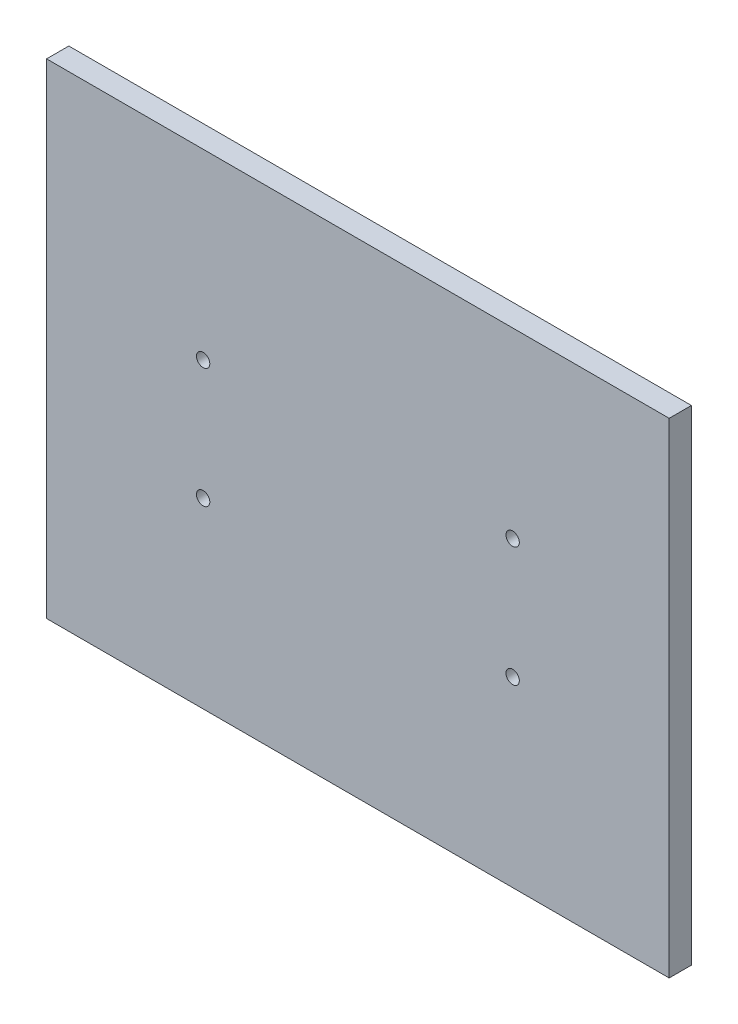
ISO-10303-21;
HEADER;
FILE_DESCRIPTION(('STEP AP214'),'2;1');
FILE_NAME('part.step','',(''),(''),'','','');
FILE_SCHEMA(('AUTOMOTIVE_DESIGN { 1 0 10303 214 1 1 1 1 }'));
ENDSEC;
DATA;
#1=APPLICATION_CONTEXT('core data for automotive mechanical design processes');
#2=APPLICATION_PROTOCOL_DEFINITION('international standard','automotive_design',2000,#1);
#3=PRODUCT_CONTEXT('',#1,'mechanical');
#4=PRODUCT('Part','Part','',(#3));
#5=PRODUCT_RELATED_PRODUCT_CATEGORY('part','',(#4));
#6=PRODUCT_DEFINITION_FORMATION('','',#4);
#7=PRODUCT_DEFINITION_CONTEXT('part definition',#1,'design');
#8=PRODUCT_DEFINITION('design','',#6,#7);
#9=PRODUCT_DEFINITION_SHAPE('','',#8);
#10=(LENGTH_UNIT() NAMED_UNIT(*) SI_UNIT(.MILLI.,.METRE.));
#11=(NAMED_UNIT(*) PLANE_ANGLE_UNIT() SI_UNIT($,.RADIAN.));
#12=(NAMED_UNIT(*) SI_UNIT($,.STERADIAN.) SOLID_ANGLE_UNIT());
#13=UNCERTAINTY_MEASURE_WITH_UNIT(LENGTH_MEASURE(1.E-05),#10,'distance_accuracy_value','');
#14=(GEOMETRIC_REPRESENTATION_CONTEXT(3) GLOBAL_UNCERTAINTY_ASSIGNED_CONTEXT((#13)) GLOBAL_UNIT_ASSIGNED_CONTEXT((#10,
#11,#12)) REPRESENTATION_CONTEXT('',''));
#15=CARTESIAN_POINT('',(0.,0.,0.));
#16=DIRECTION('',(0.,0.,1.));
#17=DIRECTION('',(1.,0.,0.));
#18=AXIS2_PLACEMENT_3D('',#15,#16,#17);
#19=CARTESIAN_POINT('',(70.,-54.5,5.));
#20=DIRECTION('',(-1.,0.,0.));
#21=DIRECTION('',(0.,0.,1.));
#22=AXIS2_PLACEMENT_3D('',#19,#20,#21);
#23=PLANE('',#22);
#24=DIRECTION('',(0.,1.,0.));
#25=VECTOR('',#24,1.);
#26=CARTESIAN_POINT('',(70.,-54.5,0.));
#27=LINE('',#26,#25);
#28=CARTESIAN_POINT('',(70.,-54.5,0.));
#29=VERTEX_POINT('',#28);
#30=CARTESIAN_POINT('',(70.,54.5,0.));
#31=VERTEX_POINT('',#30);
#32=EDGE_CURVE('E107',#29,#31,#27,.T.);
#33=ORIENTED_EDGE('',*,*,#32,.T.);
#34=DIRECTION('',(0.,0.,-1.));
#35=VECTOR('',#34,1.);
#36=CARTESIAN_POINT('',(70.,54.5,5.));
#37=LINE('',#36,#35);
#38=CARTESIAN_POINT('',(70.,54.5,5.));
#39=VERTEX_POINT('',#38);
#40=EDGE_CURVE('E11',#39,#31,#37,.T.);
#41=ORIENTED_EDGE('',*,*,#40,.F.);
#42=DIRECTION('',(0.,1.,0.));
#43=VECTOR('',#42,1.);
#44=CARTESIAN_POINT('',(70.,-54.5,5.));
#45=LINE('',#44,#43);
#46=CARTESIAN_POINT('',(70.,-54.5,5.));
#47=VERTEX_POINT('',#46);
#48=EDGE_CURVE('E91',#47,#39,#45,.T.);
#49=ORIENTED_EDGE('',*,*,#48,.F.);
#50=DIRECTION('',(0.,0.,-1.));
#51=VECTOR('',#50,1.);
#52=CARTESIAN_POINT('',(70.,-54.5,5.));
#53=LINE('',#52,#51);
#54=EDGE_CURVE('E103',#47,#29,#53,.T.);
#55=ORIENTED_EDGE('',*,*,#54,.T.);
#56=EDGE_LOOP('',(#33,#41,#49,#55));
#57=FACE_BOUND('',#56,.T.);
#58=ADVANCED_FACE('F39',(#57),#23,.F.);
#59=CARTESIAN_POINT('',(-70.,54.5,5.));
#60=DIRECTION('',(0.,-1.,0.));
#61=DIRECTION('',(0.,0.,-1.));
#62=AXIS2_PLACEMENT_3D('',#59,#60,#61);
#63=PLANE('',#62);
#64=DIRECTION('',(-1.,0.,0.));
#65=VECTOR('',#64,1.);
#66=CARTESIAN_POINT('',(-70.,54.5,0.));
#67=LINE('',#66,#65);
#68=CARTESIAN_POINT('',(-70.,54.5,0.));
#69=VERTEX_POINT('',#68);
#70=EDGE_CURVE('E96',#31,#69,#67,.T.);
#71=ORIENTED_EDGE('',*,*,#70,.T.);
#72=DIRECTION('',(0.,0.,-1.));
#73=VECTOR('',#72,1.);
#74=CARTESIAN_POINT('',(-70.,54.5,5.));
#75=LINE('',#74,#73);
#76=CARTESIAN_POINT('',(-70.,54.5,5.));
#77=VERTEX_POINT('',#76);
#78=EDGE_CURVE('E48',#77,#69,#75,.T.);
#79=ORIENTED_EDGE('',*,*,#78,.F.);
#80=DIRECTION('',(-1.,0.,0.));
#81=VECTOR('',#80,1.);
#82=CARTESIAN_POINT('',(-70.,54.5,5.));
#83=LINE('',#82,#81);
#84=EDGE_CURVE('E86',#39,#77,#83,.T.);
#85=ORIENTED_EDGE('',*,*,#84,.F.);
#86=ORIENTED_EDGE('',*,*,#40,.T.);
#87=EDGE_LOOP('',(#71,#79,#85,#86));
#88=FACE_BOUND('',#87,.T.);
#89=ADVANCED_FACE('F95',(#88),#63,.F.);
#90=CARTESIAN_POINT('',(-70.,-54.5,5.));
#91=DIRECTION('',(1.,0.,0.));
#92=DIRECTION('',(0.,0.,-1.));
#93=AXIS2_PLACEMENT_3D('',#90,#91,#92);
#94=PLANE('',#93);
#95=DIRECTION('',(0.,-1.,0.));
#96=VECTOR('',#95,1.);
#97=CARTESIAN_POINT('',(-70.,-54.5,0.));
#98=LINE('',#97,#96);
#99=CARTESIAN_POINT('',(-70.,-54.5,0.));
#100=VERTEX_POINT('',#99);
#101=EDGE_CURVE('E73',#69,#100,#98,.T.);
#102=ORIENTED_EDGE('',*,*,#101,.T.);
#103=DIRECTION('',(0.,0.,-1.));
#104=VECTOR('',#103,1.);
#105=CARTESIAN_POINT('',(-70.,-54.5,5.));
#106=LINE('',#105,#104);
#107=CARTESIAN_POINT('',(-70.,-54.5,5.));
#108=VERTEX_POINT('',#107);
#109=EDGE_CURVE('E98',#108,#100,#106,.T.);
#110=ORIENTED_EDGE('',*,*,#109,.F.);
#111=DIRECTION('',(0.,-1.,0.));
#112=VECTOR('',#111,1.);
#113=CARTESIAN_POINT('',(-70.,-54.5,5.));
#114=LINE('',#113,#112);
#115=EDGE_CURVE('E89',#77,#108,#114,.T.);
#116=ORIENTED_EDGE('',*,*,#115,.F.);
#117=ORIENTED_EDGE('',*,*,#78,.T.);
#118=EDGE_LOOP('',(#102,#110,#116,#117));
#119=FACE_BOUND('',#118,.T.);
#120=ADVANCED_FACE('F99',(#119),#94,.F.);
#121=CARTESIAN_POINT('',(-70.,-54.5,5.));
#122=DIRECTION('',(0.,1.,0.));
#123=DIRECTION('',(0.,0.,1.));
#124=AXIS2_PLACEMENT_3D('',#121,#122,#123);
#125=PLANE('',#124);
#126=DIRECTION('',(1.,0.,0.));
#127=VECTOR('',#126,1.);
#128=CARTESIAN_POINT('',(-70.,-54.5,0.));
#129=LINE('',#128,#127);
#130=EDGE_CURVE('E79',#100,#29,#129,.T.);
#131=ORIENTED_EDGE('',*,*,#130,.T.);
#132=ORIENTED_EDGE('',*,*,#54,.F.);
#133=DIRECTION('',(1.,0.,0.));
#134=VECTOR('',#133,1.);
#135=CARTESIAN_POINT('',(-70.,-54.5,5.));
#136=LINE('',#135,#134);
#137=EDGE_CURVE('E56',#108,#47,#136,.T.);
#138=ORIENTED_EDGE('',*,*,#137,.F.);
#139=ORIENTED_EDGE('',*,*,#109,.T.);
#140=EDGE_LOOP('',(#131,#132,#138,#139));
#141=FACE_BOUND('',#140,.T.);
#142=ADVANCED_FACE('F121',(#141),#125,.F.);
#143=CARTESIAN_POINT('',(0.,0.,5.));
#144=DIRECTION('',(0.,0.,-1.));
#145=DIRECTION('',(-1.,0.,0.));
#146=AXIS2_PLACEMENT_3D('',#143,#144,#145);
#147=PLANE('',#146);
#148=CARTESIAN_POINT('',(-34.7999999999997,-13.46,5.));
#149=DIRECTION('',(0.,0.,1.));
#150=DIRECTION('',(1.,0.,0.));
#151=AXIS2_PLACEMENT_3D('',#148,#149,#150);
#152=CIRCLE('',#151,1.5);
#153=CARTESIAN_POINT('',(-33.2999999999997,-13.46,5.));
#154=VERTEX_POINT('',#153);
#155=EDGE_CURVE('E136',#154,#154,#152,.T.);
#156=ORIENTED_EDGE('',*,*,#155,.F.);
#157=EDGE_LOOP('',(#156));
#158=FACE_BOUND('',#157,.T.);
#159=CARTESIAN_POINT('',(34.8000000000003,-13.46,5.));
#160=DIRECTION('',(0.,0.,1.));
#161=DIRECTION('',(1.,0.,0.));
#162=AXIS2_PLACEMENT_3D('',#159,#160,#161);
#163=CIRCLE('',#162,1.5);
#164=CARTESIAN_POINT('',(36.3000000000003,-13.46,5.));
#165=VERTEX_POINT('',#164);
#166=EDGE_CURVE('E144',#165,#165,#163,.T.);
#167=ORIENTED_EDGE('',*,*,#166,.F.);
#168=EDGE_LOOP('',(#167));
#169=FACE_BOUND('',#168,.T.);
#170=CARTESIAN_POINT('',(34.8,13.46,5.));
#171=DIRECTION('',(0.,0.,1.));
#172=DIRECTION('',(1.,0.,0.));
#173=AXIS2_PLACEMENT_3D('',#170,#171,#172);
#174=CIRCLE('',#173,1.5);
#175=CARTESIAN_POINT('',(36.3,13.46,5.));
#176=VERTEX_POINT('',#175);
#177=EDGE_CURVE('E152',#176,#176,#174,.T.);
#178=ORIENTED_EDGE('',*,*,#177,.F.);
#179=EDGE_LOOP('',(#178));
#180=FACE_BOUND('',#179,.T.);
#181=CARTESIAN_POINT('',(-34.8,13.46,5.));
#182=DIRECTION('',(0.,0.,1.));
#183=DIRECTION('',(1.,0.,0.));
#184=AXIS2_PLACEMENT_3D('',#181,#182,#183);
#185=CIRCLE('',#184,1.5);
#186=CARTESIAN_POINT('',(-33.3,13.46,5.));
#187=VERTEX_POINT('',#186);
#188=EDGE_CURVE('E128',#187,#187,#185,.T.);
#189=ORIENTED_EDGE('',*,*,#188,.F.);
#190=EDGE_LOOP('',(#189));
#191=FACE_BOUND('',#190,.T.);
#192=ORIENTED_EDGE('',*,*,#48,.T.);
#193=ORIENTED_EDGE('',*,*,#84,.T.);
#194=ORIENTED_EDGE('',*,*,#115,.T.);
#195=ORIENTED_EDGE('',*,*,#137,.T.);
#196=EDGE_LOOP('',(#192,#193,#194,#195));
#197=FACE_BOUND('',#196,.T.);
#198=ADVANCED_FACE('F87',(#158,#169,#180,#191,#197),#147,.F.);
#199=CARTESIAN_POINT('',(0.,0.,0.));
#200=DIRECTION('',(0.,0.,-1.));
#201=DIRECTION('',(-1.,0.,0.));
#202=AXIS2_PLACEMENT_3D('',#199,#200,#201);
#203=PLANE('',#202);
#204=CARTESIAN_POINT('',(-34.7999999999997,-13.46,0.));
#205=DIRECTION('',(0.,0.,1.));
#206=DIRECTION('',(1.,0.,0.));
#207=AXIS2_PLACEMENT_3D('',#204,#205,#206);
#208=CIRCLE('',#207,1.5);
#209=CARTESIAN_POINT('',(-33.2999999999997,-13.46,0.));
#210=VERTEX_POINT('',#209);
#211=EDGE_CURVE('E140',#210,#210,#208,.T.);
#212=ORIENTED_EDGE('',*,*,#211,.T.);
#213=EDGE_LOOP('',(#212));
#214=FACE_BOUND('',#213,.T.);
#215=CARTESIAN_POINT('',(34.8000000000003,-13.46,0.));
#216=DIRECTION('',(0.,0.,1.));
#217=DIRECTION('',(1.,0.,0.));
#218=AXIS2_PLACEMENT_3D('',#215,#216,#217);
#219=CIRCLE('',#218,1.5);
#220=CARTESIAN_POINT('',(36.3000000000003,-13.46,0.));
#221=VERTEX_POINT('',#220);
#222=EDGE_CURVE('E148',#221,#221,#219,.T.);
#223=ORIENTED_EDGE('',*,*,#222,.T.);
#224=EDGE_LOOP('',(#223));
#225=FACE_BOUND('',#224,.T.);
#226=CARTESIAN_POINT('',(34.8,13.46,0.));
#227=DIRECTION('',(0.,0.,1.));
#228=DIRECTION('',(1.,0.,0.));
#229=AXIS2_PLACEMENT_3D('',#226,#227,#228);
#230=CIRCLE('',#229,1.5);
#231=CARTESIAN_POINT('',(36.3,13.46,0.));
#232=VERTEX_POINT('',#231);
#233=EDGE_CURVE('E132',#232,#232,#230,.T.);
#234=ORIENTED_EDGE('',*,*,#233,.T.);
#235=EDGE_LOOP('',(#234));
#236=FACE_BOUND('',#235,.T.);
#237=CARTESIAN_POINT('',(-34.8,13.46,0.));
#238=DIRECTION('',(0.,0.,1.));
#239=DIRECTION('',(1.,0.,0.));
#240=AXIS2_PLACEMENT_3D('',#237,#238,#239);
#241=CIRCLE('',#240,1.5);
#242=CARTESIAN_POINT('',(-33.3,13.46,0.));
#243=VERTEX_POINT('',#242);
#244=EDGE_CURVE('E111',#243,#243,#241,.T.);
#245=ORIENTED_EDGE('',*,*,#244,.T.);
#246=EDGE_LOOP('',(#245));
#247=FACE_BOUND('',#246,.T.);
#248=ORIENTED_EDGE('',*,*,#32,.F.);
#249=ORIENTED_EDGE('',*,*,#130,.F.);
#250=ORIENTED_EDGE('',*,*,#101,.F.);
#251=ORIENTED_EDGE('',*,*,#70,.F.);
#252=EDGE_LOOP('',(#248,#249,#250,#251));
#253=FACE_BOUND('',#252,.T.);
#254=ADVANCED_FACE('F124',(#214,#225,#236,#247,#253),#203,.T.);
#255=CARTESIAN_POINT('',(-34.8,13.46,0.));
#256=DIRECTION('',(0.,0.,1.));
#257=DIRECTION('',(1.,0.,0.));
#258=AXIS2_PLACEMENT_3D('',#255,#256,#257);
#259=CYLINDRICAL_SURFACE('',#258,1.5);
#260=ORIENTED_EDGE('',*,*,#244,.F.);
#261=EDGE_LOOP('',(#260));
#262=FACE_BOUND('',#261,.T.);
#263=ORIENTED_EDGE('',*,*,#188,.T.);
#264=EDGE_LOOP('',(#263));
#265=FACE_BOUND('',#264,.T.);
#266=ADVANCED_FACE('F166',(#262,#265),#259,.F.);
#267=CARTESIAN_POINT('',(34.8,13.46,0.));
#268=DIRECTION('',(0.,0.,1.));
#269=DIRECTION('',(1.,0.,0.));
#270=AXIS2_PLACEMENT_3D('',#267,#268,#269);
#271=CYLINDRICAL_SURFACE('',#270,1.5);
#272=ORIENTED_EDGE('',*,*,#233,.F.);
#273=EDGE_LOOP('',(#272));
#274=FACE_BOUND('',#273,.T.);
#275=ORIENTED_EDGE('',*,*,#177,.T.);
#276=EDGE_LOOP('',(#275));
#277=FACE_BOUND('',#276,.T.);
#278=ADVANCED_FACE('F162',(#274,#277),#271,.F.);
#279=CARTESIAN_POINT('',(34.8000000000003,-13.46,0.));
#280=DIRECTION('',(0.,0.,1.));
#281=DIRECTION('',(1.,0.,0.));
#282=AXIS2_PLACEMENT_3D('',#279,#280,#281);
#283=CYLINDRICAL_SURFACE('',#282,1.5);
#284=ORIENTED_EDGE('',*,*,#222,.F.);
#285=EDGE_LOOP('',(#284));
#286=FACE_BOUND('',#285,.T.);
#287=ORIENTED_EDGE('',*,*,#166,.T.);
#288=EDGE_LOOP('',(#287));
#289=FACE_BOUND('',#288,.T.);
#290=ADVANCED_FACE('F165',(#286,#289),#283,.F.);
#291=CARTESIAN_POINT('',(-34.7999999999997,-13.46,0.));
#292=DIRECTION('',(0.,0.,1.));
#293=DIRECTION('',(1.,0.,0.));
#294=AXIS2_PLACEMENT_3D('',#291,#292,#293);
#295=CYLINDRICAL_SURFACE('',#294,1.5);
#296=ORIENTED_EDGE('',*,*,#211,.F.);
#297=EDGE_LOOP('',(#296));
#298=FACE_BOUND('',#297,.T.);
#299=ORIENTED_EDGE('',*,*,#155,.T.);
#300=EDGE_LOOP('',(#299));
#301=FACE_BOUND('',#300,.T.);
#302=ADVANCED_FACE('F227',(#298,#301),#295,.F.);
#303=CLOSED_SHELL('',(#58,#89,#120,#142,#198,#254,#266,#278,#290,#302));
#304=MANIFOLD_SOLID_BREP('B2',#303);
#305=ADVANCED_BREP_SHAPE_REPRESENTATION('',(#18,#304),#14);
#306=SHAPE_DEFINITION_REPRESENTATION(#9,#305);
ENDSEC;
END-ISO-10303-21;
